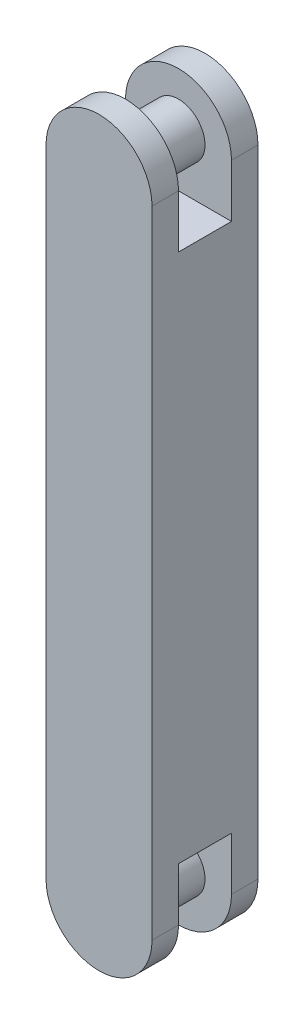
ISO-10303-21;
HEADER;
FILE_DESCRIPTION(('STEP AP214'),'2;1');
FILE_NAME('part.step','',(''),(''),'','','');
FILE_SCHEMA(('AUTOMOTIVE_DESIGN { 1 0 10303 214 1 1 1 1 }'));
ENDSEC;
DATA;
#1=APPLICATION_CONTEXT('core data for automotive mechanical design processes');
#2=APPLICATION_PROTOCOL_DEFINITION('international standard','automotive_design',2000,#1);
#3=PRODUCT_CONTEXT('',#1,'mechanical');
#4=PRODUCT('Part','Part','',(#3));
#5=PRODUCT_RELATED_PRODUCT_CATEGORY('part','',(#4));
#6=PRODUCT_DEFINITION_FORMATION('','',#4);
#7=PRODUCT_DEFINITION_CONTEXT('part definition',#1,'design');
#8=PRODUCT_DEFINITION('design','',#6,#7);
#9=PRODUCT_DEFINITION_SHAPE('','',#8);
#10=(LENGTH_UNIT() NAMED_UNIT(*) SI_UNIT(.MILLI.,.METRE.));
#11=(NAMED_UNIT(*) PLANE_ANGLE_UNIT() SI_UNIT($,.RADIAN.));
#12=(NAMED_UNIT(*) SI_UNIT($,.STERADIAN.) SOLID_ANGLE_UNIT());
#13=UNCERTAINTY_MEASURE_WITH_UNIT(LENGTH_MEASURE(1.E-05),#10,'distance_accuracy_value','');
#14=(GEOMETRIC_REPRESENTATION_CONTEXT(3) GLOBAL_UNCERTAINTY_ASSIGNED_CONTEXT((#13)) GLOBAL_UNIT_ASSIGNED_CONTEXT((#10,
#11,#12)) REPRESENTATION_CONTEXT('',''));
#15=CARTESIAN_POINT('',(0.,0.,0.));
#16=DIRECTION('',(0.,0.,1.));
#17=DIRECTION('',(1.,0.,0.));
#18=AXIS2_PLACEMENT_3D('',#15,#16,#17);
#19=CARTESIAN_POINT('',(0.,0.,25.4));
#20=DIRECTION('',(0.,0.,-1.));
#21=DIRECTION('',(-1.,0.,0.));
#22=AXIS2_PLACEMENT_3D('',#19,#20,#21);
#23=CYLINDRICAL_SURFACE('',#22,25.4);
#24=DIRECTION('',(0.,0.,-1.));
#25=VECTOR('',#24,1.);
#26=CARTESIAN_POINT('',(25.4,0.,25.4));
#27=LINE('',#26,#25);
#28=CARTESIAN_POINT('',(25.4,0.,-12.7));
#29=VERTEX_POINT('',#28);
#30=CARTESIAN_POINT('',(25.4,0.,-25.4));
#31=VERTEX_POINT('',#30);
#32=EDGE_CURVE('E57',#29,#31,#27,.T.);
#33=ORIENTED_EDGE('',*,*,#32,.F.);
#34=CARTESIAN_POINT('',(0.,0.,-12.7));
#35=DIRECTION('',(0.,0.,-1.));
#36=DIRECTION('',(0.,1.,0.));
#37=AXIS2_PLACEMENT_3D('',#34,#35,#36);
#38=CIRCLE('',#37,25.4);
#39=CARTESIAN_POINT('',(-25.4,0.,-12.7));
#40=VERTEX_POINT('',#39);
#41=EDGE_CURVE('E213',#29,#40,#38,.T.);
#42=ORIENTED_EDGE('',*,*,#41,.T.);
#43=DIRECTION('',(0.,0.,-1.));
#44=VECTOR('',#43,1.);
#45=CARTESIAN_POINT('',(-25.4,0.,25.4));
#46=LINE('',#45,#44);
#47=CARTESIAN_POINT('',(-25.4,0.,-25.4));
#48=VERTEX_POINT('',#47);
#49=EDGE_CURVE('E233',#40,#48,#46,.T.);
#50=ORIENTED_EDGE('',*,*,#49,.T.);
#51=CARTESIAN_POINT('',(0.,0.,-25.4));
#52=DIRECTION('',(0.,0.,1.));
#53=DIRECTION('',(1.,0.,0.));
#54=AXIS2_PLACEMENT_3D('',#51,#52,#53);
#55=CIRCLE('',#54,25.4);
#56=EDGE_CURVE('E218',#48,#31,#55,.T.);
#57=ORIENTED_EDGE('',*,*,#56,.T.);
#58=EDGE_LOOP('',(#33,#42,#50,#57));
#59=FACE_BOUND('',#58,.T.);
#60=ADVANCED_FACE('F50',(#59),#23,.T.);
#61=CARTESIAN_POINT('',(25.4,0.,25.4));
#62=DIRECTION('',(-1.,0.,0.));
#63=DIRECTION('',(0.,0.,1.));
#64=AXIS2_PLACEMENT_3D('',#61,#62,#63);
#65=PLANE('',#64);
#66=DIRECTION('',(0.,-1.,0.));
#67=VECTOR('',#66,1.);
#68=CARTESIAN_POINT('',(25.4,330.2,12.7));
#69=LINE('',#68,#67);
#70=CARTESIAN_POINT('',(25.4,304.8,12.7));
#71=VERTEX_POINT('',#70);
#72=CARTESIAN_POINT('',(25.4,279.4,12.7));
#73=VERTEX_POINT('',#72);
#74=EDGE_CURVE('E136',#71,#73,#69,.T.);
#75=ORIENTED_EDGE('',*,*,#74,.F.);
#76=DIRECTION('',(0.,0.,-1.));
#77=VECTOR('',#76,1.);
#78=CARTESIAN_POINT('',(25.4,304.8,25.4));
#79=LINE('',#78,#77);
#80=CARTESIAN_POINT('',(25.4,304.8,25.4));
#81=VERTEX_POINT('',#80);
#82=EDGE_CURVE('E256',#81,#71,#79,.T.);
#83=ORIENTED_EDGE('',*,*,#82,.F.);
#84=DIRECTION('',(0.,1.,0.));
#85=VECTOR('',#84,1.);
#86=CARTESIAN_POINT('',(25.4,0.,25.4));
#87=LINE('',#86,#85);
#88=CARTESIAN_POINT('',(25.4,0.,25.4));
#89=VERTEX_POINT('',#88);
#90=EDGE_CURVE('E221',#89,#81,#87,.T.);
#91=ORIENTED_EDGE('',*,*,#90,.F.);
#92=CARTESIAN_POINT('',(25.4,0.,12.7));
#93=VERTEX_POINT('',#92);
#94=EDGE_CURVE('E11',#89,#93,#27,.T.);
#95=ORIENTED_EDGE('',*,*,#94,.T.);
#96=DIRECTION('',(0.,-1.,0.));
#97=VECTOR('',#96,1.);
#98=CARTESIAN_POINT('',(25.4,-25.4,12.7));
#99=LINE('',#98,#97);
#100=CARTESIAN_POINT('',(25.4,25.4,12.7));
#101=VERTEX_POINT('',#100);
#102=EDGE_CURVE('E149',#101,#93,#99,.T.);
#103=ORIENTED_EDGE('',*,*,#102,.F.);
#104=DIRECTION('',(0.,0.,1.));
#105=VECTOR('',#104,1.);
#106=CARTESIAN_POINT('',(25.4,25.4,12.7));
#107=LINE('',#106,#105);
#108=CARTESIAN_POINT('',(25.4,25.4,-12.7));
#109=VERTEX_POINT('',#108);
#110=EDGE_CURVE('E200',#109,#101,#107,.T.);
#111=ORIENTED_EDGE('',*,*,#110,.F.);
#112=DIRECTION('',(0.,1.,0.));
#113=VECTOR('',#112,1.);
#114=CARTESIAN_POINT('',(25.4,-25.4,-12.7));
#115=LINE('',#114,#113);
#116=EDGE_CURVE('E201',#29,#109,#115,.T.);
#117=ORIENTED_EDGE('',*,*,#116,.F.);
#118=ORIENTED_EDGE('',*,*,#32,.T.);
#119=DIRECTION('',(0.,1.,0.));
#120=VECTOR('',#119,1.);
#121=CARTESIAN_POINT('',(25.4,0.,-25.4));
#122=LINE('',#121,#120);
#123=CARTESIAN_POINT('',(25.4,304.8,-25.4));
#124=VERTEX_POINT('',#123);
#125=EDGE_CURVE('E236',#31,#124,#122,.T.);
#126=ORIENTED_EDGE('',*,*,#125,.T.);
#127=CARTESIAN_POINT('',(25.4,304.8,-12.7));
#128=VERTEX_POINT('',#127);
#129=EDGE_CURVE('E260',#128,#124,#79,.T.);
#130=ORIENTED_EDGE('',*,*,#129,.F.);
#131=DIRECTION('',(0.,1.,0.));
#132=VECTOR('',#131,1.);
#133=CARTESIAN_POINT('',(25.4,330.2,-12.7));
#134=LINE('',#133,#132);
#135=CARTESIAN_POINT('',(25.4,279.4,-12.7));
#136=VERTEX_POINT('',#135);
#137=EDGE_CURVE('E163',#136,#128,#134,.T.);
#138=ORIENTED_EDGE('',*,*,#137,.F.);
#139=DIRECTION('',(0.,0.,-1.));
#140=VECTOR('',#139,1.);
#141=CARTESIAN_POINT('',(25.4,279.4,12.7));
#142=LINE('',#141,#140);
#143=EDGE_CURVE('E146',#73,#136,#142,.T.);
#144=ORIENTED_EDGE('',*,*,#143,.F.);
#145=EDGE_LOOP('',(#75,#83,#91,#95,#103,#111,#117,#118,#126,#130,#138,#144));
#146=FACE_BOUND('',#145,.T.);
#147=ADVANCED_FACE('F161',(#146),#65,.F.);
#148=CARTESIAN_POINT('',(0.,304.8,25.4));
#149=DIRECTION('',(0.,0.,-1.));
#150=DIRECTION('',(-1.,0.,0.));
#151=AXIS2_PLACEMENT_3D('',#148,#149,#150);
#152=CYLINDRICAL_SURFACE('',#151,25.4);
#153=ORIENTED_EDGE('',*,*,#82,.T.);
#154=CARTESIAN_POINT('',(0.,304.8,12.7));
#155=DIRECTION('',(0.,0.,1.));
#156=DIRECTION('',(0.,-1.,0.));
#157=AXIS2_PLACEMENT_3D('',#154,#155,#156);
#158=CIRCLE('',#157,25.4);
#159=CARTESIAN_POINT('',(-25.4,304.8,12.7));
#160=VERTEX_POINT('',#159);
#161=EDGE_CURVE('E142',#71,#160,#158,.T.);
#162=ORIENTED_EDGE('',*,*,#161,.T.);
#163=DIRECTION('',(0.,0.,-1.));
#164=VECTOR('',#163,1.);
#165=CARTESIAN_POINT('',(-25.4,304.8,25.4));
#166=LINE('',#165,#164);
#167=CARTESIAN_POINT('',(-25.4,304.8,25.4));
#168=VERTEX_POINT('',#167);
#169=EDGE_CURVE('E255',#168,#160,#166,.T.);
#170=ORIENTED_EDGE('',*,*,#169,.F.);
#171=CARTESIAN_POINT('',(0.,304.8,25.4));
#172=DIRECTION('',(0.,0.,1.));
#173=DIRECTION('',(1.,0.,0.));
#174=AXIS2_PLACEMENT_3D('',#171,#172,#173);
#175=CIRCLE('',#174,25.4);
#176=EDGE_CURVE('E230',#81,#168,#175,.T.);
#177=ORIENTED_EDGE('',*,*,#176,.F.);
#178=EDGE_LOOP('',(#153,#162,#170,#177));
#179=FACE_BOUND('',#178,.T.);
#180=ADVANCED_FACE('F300',(#179),#152,.T.);
#181=CARTESIAN_POINT('',(0.,0.,25.4));
#182=DIRECTION('',(0.,0.,1.));
#183=DIRECTION('',(1.,0.,0.));
#184=AXIS2_PLACEMENT_3D('',#181,#182,#183);
#185=PLANE('',#184);
#186=CARTESIAN_POINT('',(0.,0.,25.4));
#187=DIRECTION('',(0.,0.,1.));
#188=DIRECTION('',(1.,0.,0.));
#189=AXIS2_PLACEMENT_3D('',#186,#187,#188);
#190=CIRCLE('',#189,25.4);
#191=CARTESIAN_POINT('',(-25.4,0.,25.4));
#192=VERTEX_POINT('',#191);
#193=EDGE_CURVE('E219',#192,#89,#190,.T.);
#194=ORIENTED_EDGE('',*,*,#193,.T.);
#195=ORIENTED_EDGE('',*,*,#90,.T.);
#196=ORIENTED_EDGE('',*,*,#176,.T.);
#197=DIRECTION('',(0.,-1.,0.));
#198=VECTOR('',#197,1.);
#199=CARTESIAN_POINT('',(-25.4,0.,25.4));
#200=LINE('',#199,#198);
#201=EDGE_CURVE('E231',#168,#192,#200,.T.);
#202=ORIENTED_EDGE('',*,*,#201,.T.);
#203=EDGE_LOOP('',(#194,#195,#196,#202));
#204=FACE_BOUND('',#203,.T.);
#205=ADVANCED_FACE('F296',(#204),#185,.T.);
#206=CARTESIAN_POINT('',(0.,0.,-25.4));
#207=DIRECTION('',(0.,0.,1.));
#208=DIRECTION('',(1.,0.,0.));
#209=AXIS2_PLACEMENT_3D('',#206,#207,#208);
#210=PLANE('',#209);
#211=ORIENTED_EDGE('',*,*,#56,.F.);
#212=DIRECTION('',(0.,-1.,0.));
#213=VECTOR('',#212,1.);
#214=CARTESIAN_POINT('',(-25.4,0.,-25.4));
#215=LINE('',#214,#213);
#216=CARTESIAN_POINT('',(-25.4,304.8,-25.4));
#217=VERTEX_POINT('',#216);
#218=EDGE_CURVE('E223',#217,#48,#215,.T.);
#219=ORIENTED_EDGE('',*,*,#218,.F.);
#220=CARTESIAN_POINT('',(0.,304.8,-25.4));
#221=DIRECTION('',(0.,0.,1.));
#222=DIRECTION('',(1.,0.,0.));
#223=AXIS2_PLACEMENT_3D('',#220,#221,#222);
#224=CIRCLE('',#223,25.4);
#225=EDGE_CURVE('E241',#124,#217,#224,.T.);
#226=ORIENTED_EDGE('',*,*,#225,.F.);
#227=ORIENTED_EDGE('',*,*,#125,.F.);
#228=EDGE_LOOP('',(#211,#219,#226,#227));
#229=FACE_BOUND('',#228,.T.);
#230=ADVANCED_FACE('F273',(#229),#210,.F.);
#231=CARTESIAN_POINT('',(-25.4,0.,12.7));
#232=VERTEX_POINT('',#231);
#233=EDGE_CURVE('E248',#192,#232,#46,.T.);
#234=ORIENTED_EDGE('',*,*,#233,.T.);
#235=CARTESIAN_POINT('',(0.,0.,12.7));
#236=DIRECTION('',(0.,0.,1.));
#237=DIRECTION('',(1.,0.,0.));
#238=AXIS2_PLACEMENT_3D('',#235,#236,#237);
#239=CIRCLE('',#238,25.4);
#240=EDGE_CURVE('E216',#232,#93,#239,.T.);
#241=ORIENTED_EDGE('',*,*,#240,.T.);
#242=ORIENTED_EDGE('',*,*,#94,.F.);
#243=ORIENTED_EDGE('',*,*,#193,.F.);
#244=EDGE_LOOP('',(#234,#241,#242,#243));
#245=FACE_BOUND('',#244,.T.);
#246=ADVANCED_FACE('F47',(#245),#23,.T.);
#247=CARTESIAN_POINT('',(0.,304.8,-12.7));
#248=DIRECTION('',(0.,0.,-1.));
#249=DIRECTION('',(0.,1.,0.));
#250=AXIS2_PLACEMENT_3D('',#247,#248,#249);
#251=CIRCLE('',#250,25.4);
#252=CARTESIAN_POINT('',(-25.4,304.8,-12.7));
#253=VERTEX_POINT('',#252);
#254=EDGE_CURVE('E178',#253,#128,#251,.T.);
#255=ORIENTED_EDGE('',*,*,#254,.T.);
#256=ORIENTED_EDGE('',*,*,#129,.T.);
#257=ORIENTED_EDGE('',*,*,#225,.T.);
#258=EDGE_CURVE('E251',#253,#217,#166,.T.);
#259=ORIENTED_EDGE('',*,*,#258,.F.);
#260=EDGE_LOOP('',(#255,#256,#257,#259));
#261=FACE_BOUND('',#260,.T.);
#262=ADVANCED_FACE('F264',(#261),#152,.T.);
#263=CARTESIAN_POINT('',(-25.4,0.,25.4));
#264=DIRECTION('',(1.,0.,0.));
#265=DIRECTION('',(0.,0.,-1.));
#266=AXIS2_PLACEMENT_3D('',#263,#264,#265);
#267=PLANE('',#266);
#268=DIRECTION('',(0.,0.,1.));
#269=VECTOR('',#268,1.);
#270=CARTESIAN_POINT('',(-25.4,25.4,12.7));
#271=LINE('',#270,#269);
#272=CARTESIAN_POINT('',(-25.4,25.4,-12.7));
#273=VERTEX_POINT('',#272);
#274=CARTESIAN_POINT('',(-25.4,25.4,12.7));
#275=VERTEX_POINT('',#274);
#276=EDGE_CURVE('E183',#273,#275,#271,.T.);
#277=ORIENTED_EDGE('',*,*,#276,.T.);
#278=DIRECTION('',(0.,-1.,0.));
#279=VECTOR('',#278,1.);
#280=CARTESIAN_POINT('',(-25.4,-25.4,12.7));
#281=LINE('',#280,#279);
#282=EDGE_CURVE('E72',#275,#232,#281,.T.);
#283=ORIENTED_EDGE('',*,*,#282,.T.);
#284=ORIENTED_EDGE('',*,*,#233,.F.);
#285=ORIENTED_EDGE('',*,*,#201,.F.);
#286=ORIENTED_EDGE('',*,*,#169,.T.);
#287=DIRECTION('',(0.,-1.,0.));
#288=VECTOR('',#287,1.);
#289=CARTESIAN_POINT('',(-25.4,330.2,12.7));
#290=LINE('',#289,#288);
#291=CARTESIAN_POINT('',(-25.4,279.4,12.7));
#292=VERTEX_POINT('',#291);
#293=EDGE_CURVE('E169',#160,#292,#290,.T.);
#294=ORIENTED_EDGE('',*,*,#293,.T.);
#295=DIRECTION('',(0.,0.,-1.));
#296=VECTOR('',#295,1.);
#297=CARTESIAN_POINT('',(-25.4,279.4,12.7));
#298=LINE('',#297,#296);
#299=CARTESIAN_POINT('',(-25.4,279.4,-12.7));
#300=VERTEX_POINT('',#299);
#301=EDGE_CURVE('E156',#292,#300,#298,.T.);
#302=ORIENTED_EDGE('',*,*,#301,.T.);
#303=DIRECTION('',(0.,1.,0.));
#304=VECTOR('',#303,1.);
#305=CARTESIAN_POINT('',(-25.4,330.2,-12.7));
#306=LINE('',#305,#304);
#307=EDGE_CURVE('E65',#300,#253,#306,.T.);
#308=ORIENTED_EDGE('',*,*,#307,.T.);
#309=ORIENTED_EDGE('',*,*,#258,.T.);
#310=ORIENTED_EDGE('',*,*,#218,.T.);
#311=ORIENTED_EDGE('',*,*,#49,.F.);
#312=DIRECTION('',(0.,1.,0.));
#313=VECTOR('',#312,1.);
#314=CARTESIAN_POINT('',(-25.4,-25.4,-12.7));
#315=LINE('',#314,#313);
#316=EDGE_CURVE('E192',#40,#273,#315,.T.);
#317=ORIENTED_EDGE('',*,*,#316,.T.);
#318=EDGE_LOOP('',(#277,#283,#284,#285,#286,#294,#302,#308,#309,#310,#311,#317));
#319=FACE_BOUND('',#318,.T.);
#320=ADVANCED_FACE('F280',(#319),#267,.F.);
#321=CARTESIAN_POINT('',(-25.4,330.2,12.7));
#322=DIRECTION('',(0.,0.,1.));
#323=DIRECTION('',(0.,-1.,0.));
#324=AXIS2_PLACEMENT_3D('',#321,#322,#323);
#325=PLANE('',#324);
#326=CARTESIAN_POINT('',(0.,304.8,12.7));
#327=DIRECTION('',(0.,0.,1.));
#328=DIRECTION('',(0.,-1.,0.));
#329=AXIS2_PLACEMENT_3D('',#326,#327,#328);
#330=CIRCLE('',#329,12.7);
#331=CARTESIAN_POINT('',(12.7,304.8,12.7));
#332=VERTEX_POINT('',#331);
#333=EDGE_CURVE('E188',#332,#332,#330,.T.);
#334=ORIENTED_EDGE('',*,*,#333,.T.);
#335=EDGE_LOOP('',(#334));
#336=FACE_BOUND('',#335,.T.);
#337=ORIENTED_EDGE('',*,*,#74,.T.);
#338=DIRECTION('',(1.,0.,0.));
#339=VECTOR('',#338,1.);
#340=CARTESIAN_POINT('',(-25.4,279.4,12.7));
#341=LINE('',#340,#339);
#342=EDGE_CURVE('E139',#292,#73,#341,.T.);
#343=ORIENTED_EDGE('',*,*,#342,.F.);
#344=ORIENTED_EDGE('',*,*,#293,.F.);
#345=ORIENTED_EDGE('',*,*,#161,.F.);
#346=EDGE_LOOP('',(#337,#343,#344,#345));
#347=FACE_BOUND('',#346,.T.);
#348=ADVANCED_FACE('F137',(#336,#347),#325,.F.);
#349=CARTESIAN_POINT('',(-25.4,330.2,-12.7));
#350=DIRECTION('',(0.,0.,-1.));
#351=DIRECTION('',(0.,1.,0.));
#352=AXIS2_PLACEMENT_3D('',#349,#350,#351);
#353=PLANE('',#352);
#354=CARTESIAN_POINT('',(0.,304.8,-12.7));
#355=DIRECTION('',(0.,0.,-1.));
#356=DIRECTION('',(0.,1.,0.));
#357=AXIS2_PLACEMENT_3D('',#354,#355,#356);
#358=CIRCLE('',#357,12.7);
#359=CARTESIAN_POINT('',(12.7,304.8,-12.7));
#360=VERTEX_POINT('',#359);
#361=EDGE_CURVE('E359',#360,#360,#358,.T.);
#362=ORIENTED_EDGE('',*,*,#361,.T.);
#363=EDGE_LOOP('',(#362));
#364=FACE_BOUND('',#363,.T.);
#365=ORIENTED_EDGE('',*,*,#254,.F.);
#366=ORIENTED_EDGE('',*,*,#307,.F.);
#367=DIRECTION('',(1.,0.,0.));
#368=VECTOR('',#367,1.);
#369=CARTESIAN_POINT('',(-25.4,279.4,-12.7));
#370=LINE('',#369,#368);
#371=EDGE_CURVE('E157',#300,#136,#370,.T.);
#372=ORIENTED_EDGE('',*,*,#371,.T.);
#373=ORIENTED_EDGE('',*,*,#137,.T.);
#374=EDGE_LOOP('',(#365,#366,#372,#373));
#375=FACE_BOUND('',#374,.T.);
#376=ADVANCED_FACE('F322',(#364,#375),#353,.F.);
#377=CARTESIAN_POINT('',(-25.4,279.4,12.7));
#378=DIRECTION('',(0.,-1.,0.));
#379=DIRECTION('',(0.,0.,-1.));
#380=AXIS2_PLACEMENT_3D('',#377,#378,#379);
#381=PLANE('',#380);
#382=ORIENTED_EDGE('',*,*,#371,.F.);
#383=ORIENTED_EDGE('',*,*,#301,.F.);
#384=ORIENTED_EDGE('',*,*,#342,.T.);
#385=ORIENTED_EDGE('',*,*,#143,.T.);
#386=EDGE_LOOP('',(#382,#383,#384,#385));
#387=FACE_BOUND('',#386,.T.);
#388=ADVANCED_FACE('F153',(#387),#381,.F.);
#389=CARTESIAN_POINT('',(-25.4,-25.4,12.7));
#390=DIRECTION('',(0.,0.,1.));
#391=DIRECTION('',(1.,0.,0.));
#392=AXIS2_PLACEMENT_3D('',#389,#390,#391);
#393=PLANE('',#392);
#394=CARTESIAN_POINT('',(0.,0.,12.7));
#395=DIRECTION('',(0.,0.,1.));
#396=DIRECTION('',(1.,0.,0.));
#397=AXIS2_PLACEMENT_3D('',#394,#395,#396);
#398=CIRCLE('',#397,12.7);
#399=CARTESIAN_POINT('',(12.7,0.,12.7));
#400=VERTEX_POINT('',#399);
#401=EDGE_CURVE('E357',#400,#400,#398,.T.);
#402=ORIENTED_EDGE('',*,*,#401,.T.);
#403=EDGE_LOOP('',(#402));
#404=FACE_BOUND('',#403,.T.);
#405=ORIENTED_EDGE('',*,*,#282,.F.);
#406=DIRECTION('',(1.,0.,0.));
#407=VECTOR('',#406,1.);
#408=CARTESIAN_POINT('',(-25.4,25.4,12.7));
#409=LINE('',#408,#407);
#410=EDGE_CURVE('E189',#275,#101,#409,.T.);
#411=ORIENTED_EDGE('',*,*,#410,.T.);
#412=ORIENTED_EDGE('',*,*,#102,.T.);
#413=ORIENTED_EDGE('',*,*,#240,.F.);
#414=EDGE_LOOP('',(#405,#411,#412,#413));
#415=FACE_BOUND('',#414,.T.);
#416=ADVANCED_FACE('F289',(#404,#415),#393,.F.);
#417=CARTESIAN_POINT('',(-25.4,-25.4,-12.7));
#418=DIRECTION('',(0.,0.,-1.));
#419=DIRECTION('',(0.,1.,0.));
#420=AXIS2_PLACEMENT_3D('',#417,#418,#419);
#421=PLANE('',#420);
#422=CARTESIAN_POINT('',(0.,0.,-12.7));
#423=DIRECTION('',(0.,0.,-1.));
#424=DIRECTION('',(0.,1.,0.));
#425=AXIS2_PLACEMENT_3D('',#422,#423,#424);
#426=CIRCLE('',#425,12.7);
#427=CARTESIAN_POINT('',(12.7,0.,-12.7));
#428=VERTEX_POINT('',#427);
#429=EDGE_CURVE('E352',#428,#428,#426,.T.);
#430=ORIENTED_EDGE('',*,*,#429,.T.);
#431=EDGE_LOOP('',(#430));
#432=FACE_BOUND('',#431,.T.);
#433=ORIENTED_EDGE('',*,*,#116,.T.);
#434=DIRECTION('',(1.,0.,0.));
#435=VECTOR('',#434,1.);
#436=CARTESIAN_POINT('',(-25.4,25.4,-12.7));
#437=LINE('',#436,#435);
#438=EDGE_CURVE('E182',#273,#109,#437,.T.);
#439=ORIENTED_EDGE('',*,*,#438,.F.);
#440=ORIENTED_EDGE('',*,*,#316,.F.);
#441=ORIENTED_EDGE('',*,*,#41,.F.);
#442=EDGE_LOOP('',(#433,#439,#440,#441));
#443=FACE_BOUND('',#442,.T.);
#444=ADVANCED_FACE('F285',(#432,#443),#421,.F.);
#445=CARTESIAN_POINT('',(-25.4,25.4,12.7));
#446=DIRECTION('',(0.,1.,0.));
#447=DIRECTION('',(0.,0.,1.));
#448=AXIS2_PLACEMENT_3D('',#445,#446,#447);
#449=PLANE('',#448);
#450=ORIENTED_EDGE('',*,*,#410,.F.);
#451=ORIENTED_EDGE('',*,*,#276,.F.);
#452=ORIENTED_EDGE('',*,*,#438,.T.);
#453=ORIENTED_EDGE('',*,*,#110,.T.);
#454=EDGE_LOOP('',(#450,#451,#452,#453));
#455=FACE_BOUND('',#454,.T.);
#456=ADVANCED_FACE('F290',(#455),#449,.F.);
#457=CARTESIAN_POINT('',(0.,0.,-61.3210244842766));
#458=DIRECTION('',(0.,0.,1.));
#459=DIRECTION('',(1.,0.,0.));
#460=AXIS2_PLACEMENT_3D('',#457,#458,#459);
#461=CYLINDRICAL_SURFACE('',#460,12.7);
#462=CARTESIAN_POINT('',(12.7,0.,-12.7));
#463=CARTESIAN_POINT('',(12.7,0.,-12.4354166666667));
#464=CARTESIAN_POINT('',(12.7,0.,-12.1708333333333));
#465=CARTESIAN_POINT('',(12.7,0.,-11.6416666666667));
#466=CARTESIAN_POINT('',(12.7,0.,-11.3770833333333));
#467=CARTESIAN_POINT('',(12.7,0.,-10.8479166666667));
#468=CARTESIAN_POINT('',(12.7,0.,-10.5833333333333));
#469=CARTESIAN_POINT('',(12.7,0.,-10.0541666666667));
#470=CARTESIAN_POINT('',(12.7,0.,-9.78958333333335));
#471=CARTESIAN_POINT('',(12.7,0.,-9.26041666666668));
#472=CARTESIAN_POINT('',(12.7,0.,-8.99583333333334));
#473=CARTESIAN_POINT('',(12.7,0.,-8.46666666666668));
#474=CARTESIAN_POINT('',(12.7,0.,-8.20208333333335));
#475=CARTESIAN_POINT('',(12.7,0.,-7.67291666666668));
#476=CARTESIAN_POINT('',(12.7,0.,-7.40833333333335));
#477=CARTESIAN_POINT('',(12.7,0.,-6.87916666666668));
#478=CARTESIAN_POINT('',(12.7,0.,-6.61458333333334));
#479=CARTESIAN_POINT('',(12.7,0.,-6.08541666666667));
#480=CARTESIAN_POINT('',(12.7,0.,-5.82083333333334));
#481=CARTESIAN_POINT('',(12.7,0.,-5.29166666666667));
#482=CARTESIAN_POINT('',(12.7,0.,-5.02708333333334));
#483=CARTESIAN_POINT('',(12.7,0.,-4.49791666666667));
#484=CARTESIAN_POINT('',(12.7,0.,-4.23333333333334));
#485=CARTESIAN_POINT('',(12.7,0.,-3.70416666666667));
#486=CARTESIAN_POINT('',(12.7,0.,-3.43958333333334));
#487=CARTESIAN_POINT('',(12.7,0.,-2.91041666666667));
#488=CARTESIAN_POINT('',(12.7,0.,-2.64583333333334));
#489=CARTESIAN_POINT('',(12.7,0.,-2.11666666666667));
#490=CARTESIAN_POINT('',(12.7,0.,-1.85208333333334));
#491=CARTESIAN_POINT('',(12.7,0.,-1.32291666666667));
#492=CARTESIAN_POINT('',(12.7,0.,-1.05833333333334));
#493=CARTESIAN_POINT('',(12.7,0.,-0.529166666666669));
#494=CARTESIAN_POINT('',(12.7,0.,-0.264583333333334));
#495=CARTESIAN_POINT('',(12.7,0.,0.264583333333334));
#496=CARTESIAN_POINT('',(12.7,0.,0.529166666666669));
#497=CARTESIAN_POINT('',(12.7,0.,1.05833333333333));
#498=CARTESIAN_POINT('',(12.7,0.,1.32291666666667));
#499=CARTESIAN_POINT('',(12.7,0.,1.85208333333333));
#500=CARTESIAN_POINT('',(12.7,0.,2.11666666666666));
#501=CARTESIAN_POINT('',(12.7,0.,2.64583333333333));
#502=CARTESIAN_POINT('',(12.7,0.,2.91041666666667));
#503=CARTESIAN_POINT('',(12.7,0.,3.43958333333334));
#504=CARTESIAN_POINT('',(12.7,0.,3.70416666666667));
#505=CARTESIAN_POINT('',(12.7,0.,4.23333333333333));
#506=CARTESIAN_POINT('',(12.7,0.,4.49791666666666));
#507=CARTESIAN_POINT('',(12.7,0.,5.02708333333333));
#508=CARTESIAN_POINT('',(12.7,0.,5.29166666666667));
#509=CARTESIAN_POINT('',(12.7,0.,5.82083333333334));
#510=CARTESIAN_POINT('',(12.7,0.,6.08541666666667));
#511=CARTESIAN_POINT('',(12.7,0.,6.61458333333333));
#512=CARTESIAN_POINT('',(12.7,0.,6.87916666666667));
#513=CARTESIAN_POINT('',(12.7,0.,7.40833333333333));
#514=CARTESIAN_POINT('',(12.7,0.,7.67291666666667));
#515=CARTESIAN_POINT('',(12.7,0.,8.20208333333334));
#516=CARTESIAN_POINT('',(12.7,0.,8.46666666666667));
#517=CARTESIAN_POINT('',(12.7,0.,8.99583333333334));
#518=CARTESIAN_POINT('',(12.7,0.,9.26041666666667));
#519=CARTESIAN_POINT('',(12.7,0.,9.78958333333334));
#520=CARTESIAN_POINT('',(12.7,0.,10.0541666666667));
#521=CARTESIAN_POINT('',(12.7,0.,10.5833333333333));
#522=CARTESIAN_POINT('',(12.7,0.,10.8479166666667));
#523=CARTESIAN_POINT('',(12.7,0.,11.3770833333333));
#524=CARTESIAN_POINT('',(12.7,0.,11.6416666666667));
#525=CARTESIAN_POINT('',(12.7,0.,12.1708333333333));
#526=CARTESIAN_POINT('',(12.7,0.,12.4354166666667));
#527=CARTESIAN_POINT('',(12.7,0.,12.7));
#528=B_SPLINE_CURVE_WITH_KNOTS('',3,(#462,#463,#464,#465,#466,#467,#468,#469,#470,#471,#472,
#473,#474,#475,#476,#477,#478,#479,#480,#481,#482,#483,#484,#485,#486,#487,#488,#489,#490,#491,
#492,#493,#494,#495,#496,#497,#498,#499,#500,#501,#502,#503,#504,#505,#506,#507,#508,#509,#510,
#511,#512,#513,#514,#515,#516,#517,#518,#519,#520,#521,#522,#523,#524,#525,#526,#527),
.UNSPECIFIED.,.F.,.F.,(4,2,2,2,2,2,2,2,2,2,2,2,2,2,2,2,2,2,2,2,2,2,2,2,2,2,2,2,2,2,2,2,4),(0.,
0.793750000000003,1.58750000000001,2.38125,3.175,3.96875000000001,4.7625,5.55625000000001,
6.35000000000001,7.14375000000001,7.93750000000001,8.73125000000001,9.52500000000001,10.31875,
11.1125,11.90625,12.7,13.49375,14.2875,15.08125,15.875,16.66875,17.4625,18.25625,19.05,19.84375,
20.6375,21.43125,22.225,23.01875,23.8125,24.60625,25.4),.UNSPECIFIED.);
#529=EDGE_CURVE('BSEAM341',#428,#400,#528,.T.);
#530=ORIENTED_EDGE('',*,*,#429,.F.);
#531=ORIENTED_EDGE('',*,*,#401,.F.);
#532=ORIENTED_EDGE('',*,*,#529,.T.);
#533=ORIENTED_EDGE('',*,*,#529,.F.);
#534=EDGE_LOOP('',(#530,#532,#531,#533));
#535=FACE_BOUND('',#534,.T.);
#536=ADVANCED_FACE('F341',(#535),#461,.T.);
#537=CARTESIAN_POINT('',(0.,304.8,-61.3210244842766));
#538=DIRECTION('',(0.,0.,1.));
#539=DIRECTION('',(1.,0.,0.));
#540=AXIS2_PLACEMENT_3D('',#537,#538,#539);
#541=CYLINDRICAL_SURFACE('',#540,12.7);
#542=CARTESIAN_POINT('',(12.7,304.8,-12.7));
#543=CARTESIAN_POINT('',(12.7,304.8,-12.4354166666667));
#544=CARTESIAN_POINT('',(12.7,304.8,-12.1708333333333));
#545=CARTESIAN_POINT('',(12.7,304.8,-11.6416666666667));
#546=CARTESIAN_POINT('',(12.7,304.8,-11.3770833333333));
#547=CARTESIAN_POINT('',(12.7,304.8,-10.8479166666667));
#548=CARTESIAN_POINT('',(12.7,304.8,-10.5833333333333));
#549=CARTESIAN_POINT('',(12.7,304.8,-10.0541666666667));
#550=CARTESIAN_POINT('',(12.7,304.8,-9.78958333333332));
#551=CARTESIAN_POINT('',(12.7,304.8,-9.26041666666666));
#552=CARTESIAN_POINT('',(12.7,304.8,-8.99583333333333));
#553=CARTESIAN_POINT('',(12.7,304.8,-8.46666666666666));
#554=CARTESIAN_POINT('',(12.7,304.8,-8.20208333333333));
#555=CARTESIAN_POINT('',(12.7,304.8,-7.67291666666666));
#556=CARTESIAN_POINT('',(12.7,304.8,-7.40833333333333));
#557=CARTESIAN_POINT('',(12.7,304.8,-6.87916666666666));
#558=CARTESIAN_POINT('',(12.7,304.8,-6.61458333333333));
#559=CARTESIAN_POINT('',(12.7,304.8,-6.08541666666666));
#560=CARTESIAN_POINT('',(12.7,304.8,-5.82083333333333));
#561=CARTESIAN_POINT('',(12.7,304.8,-5.29166666666666));
#562=CARTESIAN_POINT('',(12.7,304.8,-5.02708333333333));
#563=CARTESIAN_POINT('',(12.7,304.8,-4.49791666666666));
#564=CARTESIAN_POINT('',(12.7,304.8,-4.23333333333333));
#565=CARTESIAN_POINT('',(12.7,304.8,-3.70416666666666));
#566=CARTESIAN_POINT('',(12.7,304.8,-3.43958333333333));
#567=CARTESIAN_POINT('',(12.7,304.8,-2.91041666666667));
#568=CARTESIAN_POINT('',(12.7,304.8,-2.64583333333333));
#569=CARTESIAN_POINT('',(12.7,304.8,-2.11666666666667));
#570=CARTESIAN_POINT('',(12.7,304.8,-1.85208333333333));
#571=CARTESIAN_POINT('',(12.7,304.8,-1.32291666666666));
#572=CARTESIAN_POINT('',(12.7,304.8,-1.05833333333333));
#573=CARTESIAN_POINT('',(12.7,304.8,-0.529166666666664));
#574=CARTESIAN_POINT('',(12.7,304.8,-0.264583333333332));
#575=CARTESIAN_POINT('',(12.7,304.8,0.264583333333332));
#576=CARTESIAN_POINT('',(12.7,304.8,0.529166666666664));
#577=CARTESIAN_POINT('',(12.7,304.8,1.05833333333333));
#578=CARTESIAN_POINT('',(12.7,304.8,1.32291666666665));
#579=CARTESIAN_POINT('',(12.7,304.8,1.85208333333332));
#580=CARTESIAN_POINT('',(12.7,304.8,2.11666666666666));
#581=CARTESIAN_POINT('',(12.7,304.8,2.64583333333333));
#582=CARTESIAN_POINT('',(12.7,304.8,2.91041666666666));
#583=CARTESIAN_POINT('',(12.7,304.8,3.43958333333332));
#584=CARTESIAN_POINT('',(12.7,304.8,3.70416666666665));
#585=CARTESIAN_POINT('',(12.7,304.8,4.23333333333332));
#586=CARTESIAN_POINT('',(12.7,304.8,4.49791666666666));
#587=CARTESIAN_POINT('',(12.7,304.8,5.02708333333333));
#588=CARTESIAN_POINT('',(12.7,304.8,5.29166666666666));
#589=CARTESIAN_POINT('',(12.7,304.8,5.82083333333332));
#590=CARTESIAN_POINT('',(12.7,304.8,6.08541666666666));
#591=CARTESIAN_POINT('',(12.7,304.8,6.61458333333332));
#592=CARTESIAN_POINT('',(12.7,304.8,6.87916666666665));
#593=CARTESIAN_POINT('',(12.7,304.8,7.40833333333332));
#594=CARTESIAN_POINT('',(12.7,304.8,7.67291666666665));
#595=CARTESIAN_POINT('',(12.7,304.8,8.20208333333332));
#596=CARTESIAN_POINT('',(12.7,304.8,8.46666666666665));
#597=CARTESIAN_POINT('',(12.7,304.8,8.99583333333332));
#598=CARTESIAN_POINT('',(12.7,304.8,9.26041666666665));
#599=CARTESIAN_POINT('',(12.7,304.8,9.78958333333332));
#600=CARTESIAN_POINT('',(12.7,304.8,10.0541666666666));
#601=CARTESIAN_POINT('',(12.7,304.8,10.5833333333333));
#602=CARTESIAN_POINT('',(12.7,304.8,10.8479166666667));
#603=CARTESIAN_POINT('',(12.7,304.8,11.3770833333333));
#604=CARTESIAN_POINT('',(12.7,304.8,11.6416666666667));
#605=CARTESIAN_POINT('',(12.7,304.8,12.1708333333333));
#606=CARTESIAN_POINT('',(12.7,304.8,12.4354166666667));
#607=CARTESIAN_POINT('',(12.7,304.8,12.7));
#608=B_SPLINE_CURVE_WITH_KNOTS('',3,(#542,#543,#544,#545,#546,#547,#548,#549,#550,#551,#552,
#553,#554,#555,#556,#557,#558,#559,#560,#561,#562,#563,#564,#565,#566,#567,#568,#569,#570,#571,
#572,#573,#574,#575,#576,#577,#578,#579,#580,#581,#582,#583,#584,#585,#586,#587,#588,#589,#590,
#591,#592,#593,#594,#595,#596,#597,#598,#599,#600,#601,#602,#603,#604,#605,#606,#607),
.UNSPECIFIED.,.F.,.F.,(4,2,2,2,2,2,2,2,2,2,2,2,2,2,2,2,2,2,2,2,2,2,2,2,2,2,2,2,2,2,2,2,4),(0.,
0.793749999999996,1.5875,2.38125,3.175,3.96874999999999,4.7625,5.55625,6.34999999999999,
7.14374999999999,7.93749999999999,8.73125,9.52499999999999,10.31875,11.1125,11.90625,12.7,
13.49375,14.2875,15.08125,15.875,16.66875,17.4625,18.25625,19.05,19.84375,20.6375,21.43125,
22.225,23.01875,23.8125,24.60625,25.4),.UNSPECIFIED.);
#609=EDGE_CURVE('BSEAM343',#360,#332,#608,.T.);
#610=ORIENTED_EDGE('',*,*,#361,.F.);
#611=ORIENTED_EDGE('',*,*,#333,.F.);
#612=ORIENTED_EDGE('',*,*,#609,.T.);
#613=ORIENTED_EDGE('',*,*,#609,.F.);
#614=EDGE_LOOP('',(#610,#612,#611,#613));
#615=FACE_BOUND('',#614,.T.);
#616=ADVANCED_FACE('F343',(#615),#541,.T.);
#617=CLOSED_SHELL('',(#60,#147,#180,#205,#230,#246,#262,#320,#348,#376,#388,#416,#444,#456,#536,#616));
#618=MANIFOLD_SOLID_BREP('B2',#617);
#619=ADVANCED_BREP_SHAPE_REPRESENTATION('',(#18,#618),#14);
#620=SHAPE_DEFINITION_REPRESENTATION(#9,#619);
ENDSEC;
END-ISO-10303-21;
